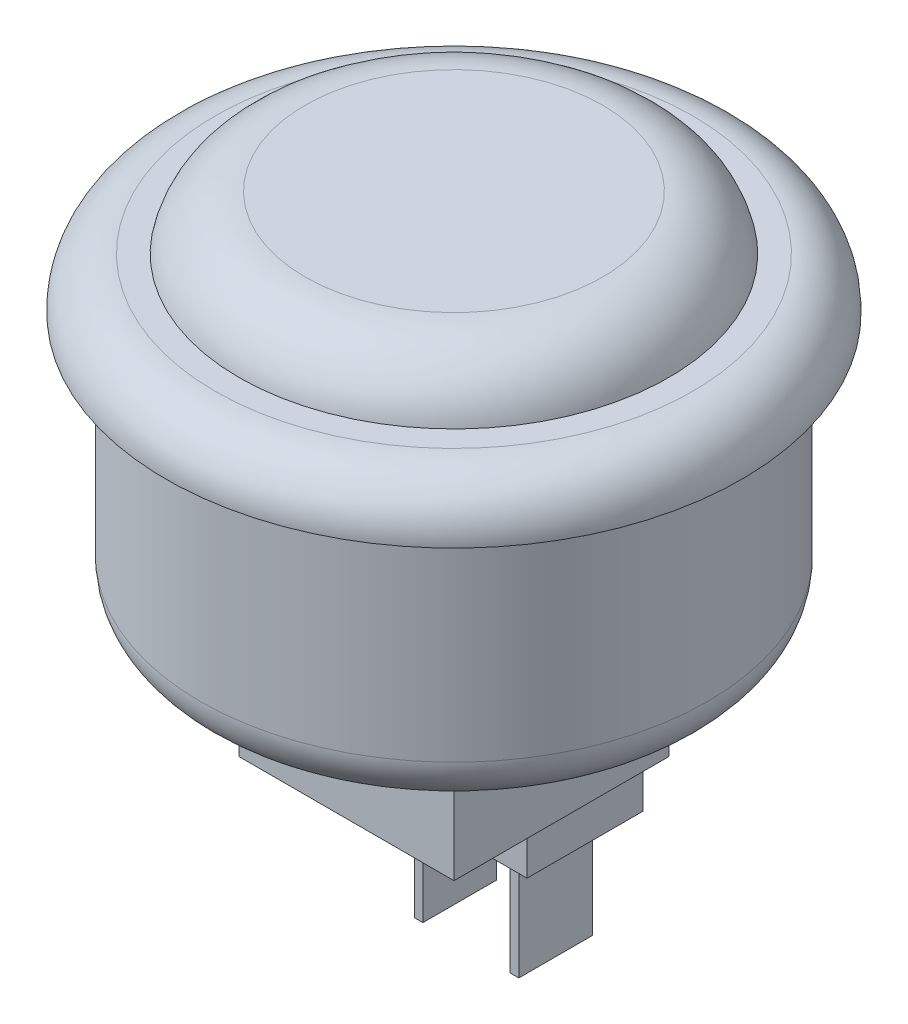
ISO-10303-21;
HEADER;
FILE_DESCRIPTION(('STEP AP214'),'2;1');
FILE_NAME('part.step','',(''),(''),'','','');
FILE_SCHEMA(('AUTOMOTIVE_DESIGN { 1 0 10303 214 1 1 1 1 }'));
ENDSEC;
DATA;
#1=APPLICATION_CONTEXT('core data for automotive mechanical design processes');
#2=APPLICATION_PROTOCOL_DEFINITION('international standard','automotive_design',2000,#1);
#3=PRODUCT_CONTEXT('',#1,'mechanical');
#4=PRODUCT('Part','Part','',(#3));
#5=PRODUCT_RELATED_PRODUCT_CATEGORY('part','',(#4));
#6=PRODUCT_DEFINITION_FORMATION('','',#4);
#7=PRODUCT_DEFINITION_CONTEXT('part definition',#1,'design');
#8=PRODUCT_DEFINITION('design','',#6,#7);
#9=PRODUCT_DEFINITION_SHAPE('','',#8);
#10=(LENGTH_UNIT() NAMED_UNIT(*) SI_UNIT(.MILLI.,.METRE.));
#11=(NAMED_UNIT(*) PLANE_ANGLE_UNIT() SI_UNIT($,.RADIAN.));
#12=(NAMED_UNIT(*) SI_UNIT($,.STERADIAN.) SOLID_ANGLE_UNIT());
#13=UNCERTAINTY_MEASURE_WITH_UNIT(LENGTH_MEASURE(1.E-05),#10,'distance_accuracy_value','');
#14=(GEOMETRIC_REPRESENTATION_CONTEXT(3) GLOBAL_UNCERTAINTY_ASSIGNED_CONTEXT((#13)) GLOBAL_UNIT_ASSIGNED_CONTEXT((#10,
#11,#12)) REPRESENTATION_CONTEXT('',''));
#15=CARTESIAN_POINT('',(0.,0.,0.));
#16=DIRECTION('',(0.,0.,1.));
#17=DIRECTION('',(1.,0.,0.));
#18=AXIS2_PLACEMENT_3D('',#15,#16,#17);
#19=CARTESIAN_POINT('',(0.,-27.8184679207263,0.));
#20=DIRECTION('',(0.,1.,0.));
#21=DIRECTION('',(0.,0.,1.));
#22=AXIS2_PLACEMENT_3D('',#19,#20,#21);
#23=PLANE('',#22);
#24=DIRECTION('',(1.,0.,0.));
#25=VECTOR('',#24,1.);
#26=CARTESIAN_POINT('',(2.54,-27.8184679207263,-0.732880570670309));
#27=LINE('',#26,#25);
#28=CARTESIAN_POINT('',(2.54,-27.8184679207263,-0.732880570670309));
#29=VERTEX_POINT('',#28);
#30=CARTESIAN_POINT('',(3.04,-27.8184679207263,-0.732880570670309));
#31=VERTEX_POINT('',#30);
#32=EDGE_CURVE('E180',#29,#31,#27,.T.);
#33=ORIENTED_EDGE('',*,*,#32,.T.);
#34=DIRECTION('',(0.,0.,-1.));
#35=VECTOR('',#34,1.);
#36=CARTESIAN_POINT('',(3.04,-27.8184679207263,-5.01711942932969));
#37=LINE('',#36,#35);
#38=CARTESIAN_POINT('',(3.04,-27.8184679207263,-5.01711942932969));
#39=VERTEX_POINT('',#38);
#40=EDGE_CURVE('E154',#31,#39,#37,.T.);
#41=ORIENTED_EDGE('',*,*,#40,.T.);
#42=DIRECTION('',(-1.,0.,0.));
#43=VECTOR('',#42,1.);
#44=CARTESIAN_POINT('',(2.54,-27.8184679207263,-5.01711942932969));
#45=LINE('',#44,#43);
#46=CARTESIAN_POINT('',(2.54,-27.8184679207263,-5.01711942932969));
#47=VERTEX_POINT('',#46);
#48=EDGE_CURVE('E170',#39,#47,#45,.T.);
#49=ORIENTED_EDGE('',*,*,#48,.T.);
#50=DIRECTION('',(0.,0.,1.));
#51=VECTOR('',#50,1.);
#52=CARTESIAN_POINT('',(2.54,-27.8184679207263,-5.01711942932969));
#53=LINE('',#52,#51);
#54=EDGE_CURVE('E50',#47,#29,#53,.T.);
#55=ORIENTED_EDGE('',*,*,#54,.T.);
#56=EDGE_LOOP('',(#33,#41,#49,#55));
#57=FACE_BOUND('',#56,.T.);
#58=DIRECTION('',(0.,0.,-1.));
#59=VECTOR('',#58,1.);
#60=CARTESIAN_POINT('',(-5.25,-27.8184679207263,-5.75));
#61=LINE('',#60,#59);
#62=CARTESIAN_POINT('',(-5.25,-27.8184679207263,0.999999999999999));
#63=VERTEX_POINT('',#62);
#64=CARTESIAN_POINT('',(-5.25,-27.8184679207263,-5.75));
#65=VERTEX_POINT('',#64);
#66=EDGE_CURVE('E219',#63,#65,#61,.T.);
#67=ORIENTED_EDGE('',*,*,#66,.T.);
#68=DIRECTION('',(1.,0.,0.));
#69=VECTOR('',#68,1.);
#70=CARTESIAN_POINT('',(-5.25,-27.8184679207263,-5.75));
#71=LINE('',#70,#69);
#72=CARTESIAN_POINT('',(5.25,-27.8184679207263,-5.75));
#73=VERTEX_POINT('',#72);
#74=EDGE_CURVE('E222',#65,#73,#71,.T.);
#75=ORIENTED_EDGE('',*,*,#74,.T.);
#76=DIRECTION('',(0.,0.,1.));
#77=VECTOR('',#76,1.);
#78=CARTESIAN_POINT('',(5.25,-27.8184679207263,-5.75));
#79=LINE('',#78,#77);
#80=CARTESIAN_POINT('',(5.25,-27.8184679207263,1.));
#81=VERTEX_POINT('',#80);
#82=EDGE_CURVE('E225',#73,#81,#79,.T.);
#83=ORIENTED_EDGE('',*,*,#82,.T.);
#84=DIRECTION('',(-1.,0.,0.));
#85=VECTOR('',#84,1.);
#86=CARTESIAN_POINT('',(-5.25,-27.8184679207263,0.999999999999999));
#87=LINE('',#86,#85);
#88=EDGE_CURVE('E227',#81,#63,#87,.T.);
#89=ORIENTED_EDGE('',*,*,#88,.T.);
#90=EDGE_LOOP('',(#67,#75,#83,#89));
#91=FACE_BOUND('',#90,.T.);
#92=DIRECTION('',(0.,0.,-1.));
#93=VECTOR('',#92,1.);
#94=CARTESIAN_POINT('',(-3.04,-27.8184679207263,-5.01711942932969));
#95=LINE('',#94,#93);
#96=CARTESIAN_POINT('',(-3.04,-27.8184679207263,-0.732880570670309));
#97=VERTEX_POINT('',#96);
#98=CARTESIAN_POINT('',(-3.04,-27.8184679207263,-5.01711942932969));
#99=VERTEX_POINT('',#98);
#100=EDGE_CURVE('E159',#97,#99,#95,.T.);
#101=ORIENTED_EDGE('',*,*,#100,.F.);
#102=DIRECTION('',(-1.,0.,0.));
#103=VECTOR('',#102,1.);
#104=CARTESIAN_POINT('',(-2.54,-27.8184679207263,-0.732880570670309));
#105=LINE('',#104,#103);
#106=CARTESIAN_POINT('',(-2.54,-27.8184679207263,-0.732880570670309));
#107=VERTEX_POINT('',#106);
#108=EDGE_CURVE('E193',#107,#97,#105,.T.);
#109=ORIENTED_EDGE('',*,*,#108,.F.);
#110=DIRECTION('',(0.,0.,1.));
#111=VECTOR('',#110,1.);
#112=CARTESIAN_POINT('',(-2.54,-27.8184679207263,-5.01711942932969));
#113=LINE('',#112,#111);
#114=CARTESIAN_POINT('',(-2.54,-27.8184679207263,-5.01711942932969));
#115=VERTEX_POINT('',#114);
#116=EDGE_CURVE('E203',#115,#107,#113,.T.);
#117=ORIENTED_EDGE('',*,*,#116,.F.);
#118=DIRECTION('',(1.,0.,0.));
#119=VECTOR('',#118,1.);
#120=CARTESIAN_POINT('',(-2.54,-27.8184679207263,-5.01711942932969));
#121=LINE('',#120,#119);
#122=EDGE_CURVE('E58',#99,#115,#121,.T.);
#123=ORIENTED_EDGE('',*,*,#122,.F.);
#124=EDGE_LOOP('',(#101,#109,#117,#123));
#125=FACE_BOUND('',#124,.T.);
#126=ADVANCED_FACE('F35',(#57,#91,#125),#23,.F.);
#127=CARTESIAN_POINT('',(0.,-24.8184679207263,0.));
#128=DIRECTION('',(0.,-1.,0.));
#129=DIRECTION('',(0.,0.,-1.));
#130=AXIS2_PLACEMENT_3D('',#127,#128,#129);
#131=PLANE('',#130);
#132=DIRECTION('',(0.,0.,-1.));
#133=VECTOR('',#132,1.);
#134=CARTESIAN_POINT('',(-6.25,-24.8184679207263,-6.25));
#135=LINE('',#134,#133);
#136=CARTESIAN_POINT('',(-6.25,-24.8184679207263,6.25));
#137=VERTEX_POINT('',#136);
#138=CARTESIAN_POINT('',(-6.25,-24.8184679207263,-6.25));
#139=VERTEX_POINT('',#138);
#140=EDGE_CURVE('E248',#137,#139,#135,.T.);
#141=ORIENTED_EDGE('',*,*,#140,.T.);
#142=DIRECTION('',(1.,0.,0.));
#143=VECTOR('',#142,1.);
#144=CARTESIAN_POINT('',(6.25,-24.8184679207263,-6.25));
#145=LINE('',#144,#143);
#146=CARTESIAN_POINT('',(6.25,-24.8184679207263,-6.25));
#147=VERTEX_POINT('',#146);
#148=EDGE_CURVE('E251',#139,#147,#145,.T.);
#149=ORIENTED_EDGE('',*,*,#148,.T.);
#150=DIRECTION('',(0.,0.,1.));
#151=VECTOR('',#150,1.);
#152=CARTESIAN_POINT('',(6.25,-24.8184679207263,-6.25));
#153=LINE('',#152,#151);
#154=CARTESIAN_POINT('',(6.25,-24.8184679207263,6.25));
#155=VERTEX_POINT('',#154);
#156=EDGE_CURVE('E254',#147,#155,#153,.T.);
#157=ORIENTED_EDGE('',*,*,#156,.T.);
#158=DIRECTION('',(-1.,0.,0.));
#159=VECTOR('',#158,1.);
#160=CARTESIAN_POINT('',(6.25,-24.8184679207263,6.25));
#161=LINE('',#160,#159);
#162=EDGE_CURVE('E256',#155,#137,#161,.T.);
#163=ORIENTED_EDGE('',*,*,#162,.T.);
#164=EDGE_LOOP('',(#141,#149,#157,#163));
#165=FACE_BOUND('',#164,.T.);
#166=DIRECTION('',(1.,0.,0.));
#167=VECTOR('',#166,1.);
#168=CARTESIAN_POINT('',(-5.25,-24.8184679207263,-5.75));
#169=LINE('',#168,#167);
#170=CARTESIAN_POINT('',(-5.25,-24.8184679207263,-5.75));
#171=VERTEX_POINT('',#170);
#172=CARTESIAN_POINT('',(5.25,-24.8184679207263,-5.75));
#173=VERTEX_POINT('',#172);
#174=EDGE_CURVE('E232',#171,#173,#169,.T.);
#175=ORIENTED_EDGE('',*,*,#174,.F.);
#176=DIRECTION('',(0.,0.,-1.));
#177=VECTOR('',#176,1.);
#178=CARTESIAN_POINT('',(-5.25,-24.8184679207263,-5.75));
#179=LINE('',#178,#177);
#180=CARTESIAN_POINT('',(-5.25,-24.8184679207263,0.999999999999999));
#181=VERTEX_POINT('',#180);
#182=EDGE_CURVE('E218',#181,#171,#179,.T.);
#183=ORIENTED_EDGE('',*,*,#182,.F.);
#184=DIRECTION('',(-1.,0.,0.));
#185=VECTOR('',#184,1.);
#186=CARTESIAN_POINT('',(-5.25,-24.8184679207263,0.999999999999999));
#187=LINE('',#186,#185);
#188=CARTESIAN_POINT('',(5.25,-24.8184679207263,1.));
#189=VERTEX_POINT('',#188);
#190=EDGE_CURVE('E223',#189,#181,#187,.T.);
#191=ORIENTED_EDGE('',*,*,#190,.F.);
#192=DIRECTION('',(0.,0.,1.));
#193=VECTOR('',#192,1.);
#194=CARTESIAN_POINT('',(5.25,-24.8184679207263,-5.75));
#195=LINE('',#194,#193);
#196=EDGE_CURVE('E234',#173,#189,#195,.T.);
#197=ORIENTED_EDGE('',*,*,#196,.F.);
#198=EDGE_LOOP('',(#175,#183,#191,#197));
#199=FACE_BOUND('',#198,.T.);
#200=ADVANCED_FACE('F309',(#165,#199),#131,.T.);
#201=CARTESIAN_POINT('',(-11.951700753752,-17.4684679207263,0.));
#202=DIRECTION('',(0.,1.,0.));
#203=DIRECTION('',(0.,0.,1.));
#204=AXIS2_PLACEMENT_3D('',#201,#202,#203);
#205=PLANE('',#204);
#206=CARTESIAN_POINT('',(0.,-17.4684679207263,0.));
#207=DIRECTION('',(0.,-1.,0.));
#208=DIRECTION('',(0.,0.,-1.));
#209=AXIS2_PLACEMENT_3D('',#206,#207,#208);
#210=CIRCLE('',#209,11.951700753752);
#211=CARTESIAN_POINT('',(0.,-17.4684679207263,-11.951700753752));
#212=VERTEX_POINT('',#211);
#213=EDGE_CURVE('E280',#212,#212,#210,.T.);
#214=ORIENTED_EDGE('',*,*,#213,.T.);
#215=EDGE_LOOP('',(#214));
#216=FACE_BOUND('',#215,.T.);
#217=DIRECTION('',(0.,0.,-1.));
#218=VECTOR('',#217,1.);
#219=CARTESIAN_POINT('',(-6.25,-17.4684679207263,-6.25));
#220=LINE('',#219,#218);
#221=CARTESIAN_POINT('',(-6.25,-17.4684679207263,6.25));
#222=VERTEX_POINT('',#221);
#223=CARTESIAN_POINT('',(-6.25,-17.4684679207263,-6.25));
#224=VERTEX_POINT('',#223);
#225=EDGE_CURVE('E247',#222,#224,#220,.T.);
#226=ORIENTED_EDGE('',*,*,#225,.F.);
#227=DIRECTION('',(-1.,0.,0.));
#228=VECTOR('',#227,1.);
#229=CARTESIAN_POINT('',(6.25,-17.4684679207263,6.25));
#230=LINE('',#229,#228);
#231=CARTESIAN_POINT('',(6.25,-17.4684679207263,6.25));
#232=VERTEX_POINT('',#231);
#233=EDGE_CURVE('E252',#232,#222,#230,.T.);
#234=ORIENTED_EDGE('',*,*,#233,.F.);
#235=DIRECTION('',(0.,0.,1.));
#236=VECTOR('',#235,1.);
#237=CARTESIAN_POINT('',(6.25,-17.4684679207263,-6.25));
#238=LINE('',#237,#236);
#239=CARTESIAN_POINT('',(6.25,-17.4684679207263,-6.25));
#240=VERTEX_POINT('',#239);
#241=EDGE_CURVE('E264',#240,#232,#238,.T.);
#242=ORIENTED_EDGE('',*,*,#241,.F.);
#243=DIRECTION('',(1.,0.,0.));
#244=VECTOR('',#243,1.);
#245=CARTESIAN_POINT('',(6.25,-17.4684679207263,-6.25));
#246=LINE('',#245,#244);
#247=EDGE_CURVE('E261',#224,#240,#246,.T.);
#248=ORIENTED_EDGE('',*,*,#247,.F.);
#249=EDGE_LOOP('',(#226,#234,#242,#248));
#250=FACE_BOUND('',#249,.T.);
#251=ADVANCED_FACE('F305',(#216,#250),#205,.F.);
#252=CARTESIAN_POINT('',(0.,3.67943207927373,0.));
#253=DIRECTION('',(0.,-1.,0.));
#254=DIRECTION('',(0.,0.,-1.));
#255=AXIS2_PLACEMENT_3D('',#252,#253,#254);
#256=PLANE('',#255);
#257=CARTESIAN_POINT('',(0.,3.67943207927373,0.));
#258=DIRECTION('',(0.,-1.,0.));
#259=DIRECTION('',(0.,0.,-1.));
#260=AXIS2_PLACEMENT_3D('',#257,#258,#259);
#261=CIRCLE('',#260,8.65936131633854);
#262=CARTESIAN_POINT('',(0.,3.67943207927373,-8.65936131633854));
#263=VERTEX_POINT('',#262);
#264=EDGE_CURVE('E11',#263,#263,#261,.T.);
#265=ORIENTED_EDGE('',*,*,#264,.F.);
#266=EDGE_LOOP('',(#265));
#267=FACE_BOUND('',#266,.T.);
#268=ADVANCED_FACE('F37',(#267),#256,.F.);
#269=CARTESIAN_POINT('',(0.,-0.237429941190199,0.));
#270=DIRECTION('',(0.,-1.,0.));
#271=DIRECTION('',(0.,0.,-1.));
#272=AXIS2_PLACEMENT_3D('',#269,#270,#271);
#273=TOROIDAL_SURFACE('',#272,8.65936131633854,3.91686202046393);
#274=CARTESIAN_POINT('',(0.,0.531532079273732,0.));
#275=DIRECTION('',(0.,-1.,0.));
#276=DIRECTION('',(0.,0.,-1.));
#277=AXIS2_PLACEMENT_3D('',#274,#275,#276);
#278=CIRCLE('',#277,12.5);
#279=CARTESIAN_POINT('',(0.,0.531532079273732,-12.5));
#280=VERTEX_POINT('',#279);
#281=EDGE_CURVE('E43',#280,#280,#278,.T.);
#282=ORIENTED_EDGE('',*,*,#281,.F.);
#283=EDGE_LOOP('',(#282));
#284=FACE_BOUND('',#283,.T.);
#285=ORIENTED_EDGE('',*,*,#264,.T.);
#286=EDGE_LOOP('',(#285));
#287=FACE_BOUND('',#286,.T.);
#288=ADVANCED_FACE('F299',(#284,#287),#273,.T.);
#289=CARTESIAN_POINT('',(-12.5,0.531532079273732,0.));
#290=DIRECTION('',(0.,-1.,0.));
#291=DIRECTION('',(0.,0.,-1.));
#292=AXIS2_PLACEMENT_3D('',#289,#290,#291);
#293=PLANE('',#292);
#294=CARTESIAN_POINT('',(0.,0.531532079273732,0.));
#295=DIRECTION('',(0.,-1.,0.));
#296=DIRECTION('',(0.,0.,-1.));
#297=AXIS2_PLACEMENT_3D('',#294,#295,#296);
#298=CIRCLE('',#297,13.8881191217168);
#299=CARTESIAN_POINT('',(0.,0.531532079273732,-13.8881191217168));
#300=VERTEX_POINT('',#299);
#301=EDGE_CURVE('E292',#300,#300,#298,.T.);
#302=ORIENTED_EDGE('',*,*,#301,.F.);
#303=EDGE_LOOP('',(#302));
#304=FACE_BOUND('',#303,.T.);
#305=ORIENTED_EDGE('',*,*,#281,.T.);
#306=EDGE_LOOP('',(#305));
#307=FACE_BOUND('',#306,.T.);
#308=ADVANCED_FACE('F297',(#304,#307),#293,.F.);
#309=CARTESIAN_POINT('',(0.,-2.33352828097341,0.));
#310=DIRECTION('',(0.,-1.,0.));
#311=DIRECTION('',(0.,0.,-1.));
#312=AXIS2_PLACEMENT_3D('',#309,#310,#311);
#313=TOROIDAL_SURFACE('',#312,13.8881191217168,2.86506036024714);
#314=CARTESIAN_POINT('',(0.,-2.46846792072627,0.));
#315=DIRECTION('',(0.,-1.,0.));
#316=DIRECTION('',(0.,0.,-1.));
#317=AXIS2_PLACEMENT_3D('',#314,#315,#316);
#318=CIRCLE('',#317,16.75);
#319=CARTESIAN_POINT('',(0.,-2.46846792072627,-16.75));
#320=VERTEX_POINT('',#319);
#321=EDGE_CURVE('E289',#320,#320,#318,.T.);
#322=ORIENTED_EDGE('',*,*,#321,.F.);
#323=EDGE_LOOP('',(#322));
#324=FACE_BOUND('',#323,.T.);
#325=ORIENTED_EDGE('',*,*,#301,.T.);
#326=EDGE_LOOP('',(#325));
#327=FACE_BOUND('',#326,.T.);
#328=ADVANCED_FACE('F368',(#324,#327),#313,.T.);
#329=CARTESIAN_POINT('',(-16.75,-2.46846792072627,0.));
#330=DIRECTION('',(0.,1.,0.));
#331=DIRECTION('',(0.,0.,1.));
#332=AXIS2_PLACEMENT_3D('',#329,#330,#331);
#333=PLANE('',#332);
#334=CARTESIAN_POINT('',(0.,-2.46846792072627,0.));
#335=DIRECTION('',(0.,-1.,0.));
#336=DIRECTION('',(0.,0.,-1.));
#337=AXIS2_PLACEMENT_3D('',#334,#335,#336);
#338=CIRCLE('',#337,14.75);
#339=CARTESIAN_POINT('',(0.,-2.46846792072627,-14.75));
#340=VERTEX_POINT('',#339);
#341=EDGE_CURVE('E286',#340,#340,#338,.T.);
#342=ORIENTED_EDGE('',*,*,#341,.F.);
#343=EDGE_LOOP('',(#342));
#344=FACE_BOUND('',#343,.T.);
#345=ORIENTED_EDGE('',*,*,#321,.T.);
#346=EDGE_LOOP('',(#345));
#347=FACE_BOUND('',#346,.T.);
#348=ADVANCED_FACE('F364',(#344,#347),#333,.F.);
#349=CARTESIAN_POINT('',(0.,0.,0.));
#350=DIRECTION('',(0.,-1.,0.));
#351=DIRECTION('',(0.,0.,-1.));
#352=AXIS2_PLACEMENT_3D('',#349,#350,#351);
#353=CYLINDRICAL_SURFACE('',#352,14.75);
#354=CARTESIAN_POINT('',(0.,-14.6701686744782,0.));
#355=DIRECTION('',(0.,-1.,0.));
#356=DIRECTION('',(0.,0.,-1.));
#357=AXIS2_PLACEMENT_3D('',#354,#355,#356);
#358=CIRCLE('',#357,14.75);
#359=CARTESIAN_POINT('',(0.,-14.6701686744782,-14.75));
#360=VERTEX_POINT('',#359);
#361=EDGE_CURVE('E283',#360,#360,#358,.T.);
#362=ORIENTED_EDGE('',*,*,#361,.F.);
#363=EDGE_LOOP('',(#362));
#364=FACE_BOUND('',#363,.T.);
#365=ORIENTED_EDGE('',*,*,#341,.T.);
#366=EDGE_LOOP('',(#365));
#367=FACE_BOUND('',#366,.T.);
#368=ADVANCED_FACE('F360',(#364,#367),#353,.T.);
#369=CARTESIAN_POINT('',(0.,-14.6701686744782,0.));
#370=DIRECTION('',(0.,-1.,0.));
#371=DIRECTION('',(0.,0.,-1.));
#372=AXIS2_PLACEMENT_3D('',#369,#370,#371);
#373=TOROIDAL_SURFACE('',#372,11.951700753752,2.79829924624802);
#374=ORIENTED_EDGE('',*,*,#213,.F.);
#375=EDGE_LOOP('',(#374));
#376=FACE_BOUND('',#375,.T.);
#377=ORIENTED_EDGE('',*,*,#361,.T.);
#378=EDGE_LOOP('',(#377));
#379=FACE_BOUND('',#378,.T.);
#380=ADVANCED_FACE('F355',(#376,#379),#373,.T.);
#381=CARTESIAN_POINT('',(-6.25,-24.8184679207263,-6.25));
#382=DIRECTION('',(1.,0.,0.));
#383=DIRECTION('',(0.,0.,-1.));
#384=AXIS2_PLACEMENT_3D('',#381,#382,#383);
#385=PLANE('',#384);
#386=ORIENTED_EDGE('',*,*,#225,.T.);
#387=DIRECTION('',(0.,1.,0.));
#388=VECTOR('',#387,1.);
#389=CARTESIAN_POINT('',(-6.25,-24.8184679207263,-6.25));
#390=LINE('',#389,#388);
#391=EDGE_CURVE('E277',#139,#224,#390,.T.);
#392=ORIENTED_EDGE('',*,*,#391,.F.);
#393=ORIENTED_EDGE('',*,*,#140,.F.);
#394=DIRECTION('',(0.,1.,0.));
#395=VECTOR('',#394,1.);
#396=CARTESIAN_POINT('',(-6.25,-24.8184679207263,6.25));
#397=LINE('',#396,#395);
#398=EDGE_CURVE('E258',#137,#222,#397,.T.);
#399=ORIENTED_EDGE('',*,*,#398,.T.);
#400=EDGE_LOOP('',(#386,#392,#393,#399));
#401=FACE_BOUND('',#400,.T.);
#402=ADVANCED_FACE('F352',(#401),#385,.F.);
#403=CARTESIAN_POINT('',(6.25,-24.8184679207263,-6.25));
#404=DIRECTION('',(0.,0.,1.));
#405=DIRECTION('',(1.,0.,0.));
#406=AXIS2_PLACEMENT_3D('',#403,#404,#405);
#407=PLANE('',#406);
#408=ORIENTED_EDGE('',*,*,#247,.T.);
#409=DIRECTION('',(0.,1.,0.));
#410=VECTOR('',#409,1.);
#411=CARTESIAN_POINT('',(6.25,-24.8184679207263,-6.25));
#412=LINE('',#411,#410);
#413=EDGE_CURVE('E274',#147,#240,#412,.T.);
#414=ORIENTED_EDGE('',*,*,#413,.F.);
#415=ORIENTED_EDGE('',*,*,#148,.F.);
#416=ORIENTED_EDGE('',*,*,#391,.T.);
#417=EDGE_LOOP('',(#408,#414,#415,#416));
#418=FACE_BOUND('',#417,.T.);
#419=ADVANCED_FACE('F348',(#418),#407,.F.);
#420=CARTESIAN_POINT('',(6.25,-24.8184679207263,-6.25));
#421=DIRECTION('',(-1.,0.,0.));
#422=DIRECTION('',(0.,0.,1.));
#423=AXIS2_PLACEMENT_3D('',#420,#421,#422);
#424=PLANE('',#423);
#425=ORIENTED_EDGE('',*,*,#241,.T.);
#426=DIRECTION('',(0.,1.,0.));
#427=VECTOR('',#426,1.);
#428=CARTESIAN_POINT('',(6.25,-24.8184679207263,6.25));
#429=LINE('',#428,#427);
#430=EDGE_CURVE('E271',#155,#232,#429,.T.);
#431=ORIENTED_EDGE('',*,*,#430,.F.);
#432=ORIENTED_EDGE('',*,*,#156,.F.);
#433=ORIENTED_EDGE('',*,*,#413,.T.);
#434=EDGE_LOOP('',(#425,#431,#432,#433));
#435=FACE_BOUND('',#434,.T.);
#436=ADVANCED_FACE('F344',(#435),#424,.F.);
#437=CARTESIAN_POINT('',(6.25,-24.8184679207263,6.25));
#438=DIRECTION('',(0.,0.,-1.));
#439=DIRECTION('',(-1.,0.,0.));
#440=AXIS2_PLACEMENT_3D('',#437,#438,#439);
#441=PLANE('',#440);
#442=ORIENTED_EDGE('',*,*,#233,.T.);
#443=ORIENTED_EDGE('',*,*,#398,.F.);
#444=ORIENTED_EDGE('',*,*,#162,.F.);
#445=ORIENTED_EDGE('',*,*,#430,.T.);
#446=EDGE_LOOP('',(#442,#443,#444,#445));
#447=FACE_BOUND('',#446,.T.);
#448=ADVANCED_FACE('F339',(#447),#441,.F.);
#449=CARTESIAN_POINT('',(-5.25,-27.8184679207263,-5.75));
#450=DIRECTION('',(1.,0.,0.));
#451=DIRECTION('',(0.,0.,-1.));
#452=AXIS2_PLACEMENT_3D('',#449,#450,#451);
#453=PLANE('',#452);
#454=ORIENTED_EDGE('',*,*,#182,.T.);
#455=DIRECTION('',(0.,1.,0.));
#456=VECTOR('',#455,1.);
#457=CARTESIAN_POINT('',(-5.25,-27.8184679207263,-5.75));
#458=LINE('',#457,#456);
#459=EDGE_CURVE('E245',#65,#171,#458,.T.);
#460=ORIENTED_EDGE('',*,*,#459,.F.);
#461=ORIENTED_EDGE('',*,*,#66,.F.);
#462=DIRECTION('',(0.,1.,0.));
#463=VECTOR('',#462,1.);
#464=CARTESIAN_POINT('',(-5.25,-27.8184679207263,0.999999999999999));
#465=LINE('',#464,#463);
#466=EDGE_CURVE('E229',#63,#181,#465,.T.);
#467=ORIENTED_EDGE('',*,*,#466,.T.);
#468=EDGE_LOOP('',(#454,#460,#461,#467));
#469=FACE_BOUND('',#468,.T.);
#470=ADVANCED_FACE('F336',(#469),#453,.F.);
#471=CARTESIAN_POINT('',(-5.25,-27.8184679207263,-5.75));
#472=DIRECTION('',(0.,0.,1.));
#473=DIRECTION('',(1.,0.,0.));
#474=AXIS2_PLACEMENT_3D('',#471,#472,#473);
#475=PLANE('',#474);
#476=ORIENTED_EDGE('',*,*,#174,.T.);
#477=DIRECTION('',(0.,1.,0.));
#478=VECTOR('',#477,1.);
#479=CARTESIAN_POINT('',(5.25,-27.8184679207263,-5.75));
#480=LINE('',#479,#478);
#481=EDGE_CURVE('E242',#73,#173,#480,.T.);
#482=ORIENTED_EDGE('',*,*,#481,.F.);
#483=ORIENTED_EDGE('',*,*,#74,.F.);
#484=ORIENTED_EDGE('',*,*,#459,.T.);
#485=EDGE_LOOP('',(#476,#482,#483,#484));
#486=FACE_BOUND('',#485,.T.);
#487=ADVANCED_FACE('F332',(#486),#475,.F.);
#488=CARTESIAN_POINT('',(5.25,-27.8184679207263,-5.75));
#489=DIRECTION('',(-1.,0.,0.));
#490=DIRECTION('',(0.,0.,1.));
#491=AXIS2_PLACEMENT_3D('',#488,#489,#490);
#492=PLANE('',#491);
#493=ORIENTED_EDGE('',*,*,#196,.T.);
#494=DIRECTION('',(0.,1.,0.));
#495=VECTOR('',#494,1.);
#496=CARTESIAN_POINT('',(5.25,-27.8184679207263,1.));
#497=LINE('',#496,#495);
#498=EDGE_CURVE('E240',#81,#189,#497,.T.);
#499=ORIENTED_EDGE('',*,*,#498,.F.);
#500=ORIENTED_EDGE('',*,*,#82,.F.);
#501=ORIENTED_EDGE('',*,*,#481,.T.);
#502=EDGE_LOOP('',(#493,#499,#500,#501));
#503=FACE_BOUND('',#502,.T.);
#504=ADVANCED_FACE('F328',(#503),#492,.F.);
#505=CARTESIAN_POINT('',(-5.25,-27.8184679207263,0.999999999999999));
#506=DIRECTION('',(0.,0.,-1.));
#507=DIRECTION('',(-1.,0.,0.));
#508=AXIS2_PLACEMENT_3D('',#505,#506,#507);
#509=PLANE('',#508);
#510=ORIENTED_EDGE('',*,*,#190,.T.);
#511=ORIENTED_EDGE('',*,*,#466,.F.);
#512=ORIENTED_EDGE('',*,*,#88,.F.);
#513=ORIENTED_EDGE('',*,*,#498,.T.);
#514=EDGE_LOOP('',(#510,#511,#512,#513));
#515=FACE_BOUND('',#514,.T.);
#516=ADVANCED_FACE('F325',(#515),#509,.F.);
#517=CARTESIAN_POINT('',(-3.04,-34.8184679207263,-5.01711942932969));
#518=DIRECTION('',(1.,0.,0.));
#519=DIRECTION('',(0.,0.,-1.));
#520=AXIS2_PLACEMENT_3D('',#517,#518,#519);
#521=PLANE('',#520);
#522=ORIENTED_EDGE('',*,*,#100,.T.);
#523=DIRECTION('',(0.,1.,0.));
#524=VECTOR('',#523,1.);
#525=CARTESIAN_POINT('',(-3.04,-34.8184679207263,-5.01711942932969));
#526=LINE('',#525,#524);
#527=CARTESIAN_POINT('',(-3.04,-34.8184679207263,-5.01711942932969));
#528=VERTEX_POINT('',#527);
#529=EDGE_CURVE('E216',#528,#99,#526,.T.);
#530=ORIENTED_EDGE('',*,*,#529,.F.);
#531=DIRECTION('',(0.,0.,-1.));
#532=VECTOR('',#531,1.);
#533=CARTESIAN_POINT('',(-3.04,-34.8184679207263,-5.01711942932969));
#534=LINE('',#533,#532);
#535=CARTESIAN_POINT('',(-3.04,-34.8184679207263,-0.732880570670309));
#536=VERTEX_POINT('',#535);
#537=EDGE_CURVE('E189',#536,#528,#534,.T.);
#538=ORIENTED_EDGE('',*,*,#537,.F.);
#539=DIRECTION('',(0.,1.,0.));
#540=VECTOR('',#539,1.);
#541=CARTESIAN_POINT('',(-3.04,-34.8184679207263,-0.732880570670309));
#542=LINE('',#541,#540);
#543=EDGE_CURVE('E199',#536,#97,#542,.T.);
#544=ORIENTED_EDGE('',*,*,#543,.T.);
#545=EDGE_LOOP('',(#522,#530,#538,#544));
#546=FACE_BOUND('',#545,.T.);
#547=ADVANCED_FACE('F323',(#546),#521,.F.);
#548=CARTESIAN_POINT('',(-2.54,-34.8184679207263,-5.01711942932969));
#549=DIRECTION('',(0.,0.,1.));
#550=DIRECTION('',(1.,0.,0.));
#551=AXIS2_PLACEMENT_3D('',#548,#549,#550);
#552=PLANE('',#551);
#553=ORIENTED_EDGE('',*,*,#122,.T.);
#554=DIRECTION('',(0.,1.,0.));
#555=VECTOR('',#554,1.);
#556=CARTESIAN_POINT('',(-2.54,-34.8184679207263,-5.01711942932969));
#557=LINE('',#556,#555);
#558=CARTESIAN_POINT('',(-2.54,-34.8184679207263,-5.01711942932969));
#559=VERTEX_POINT('',#558);
#560=EDGE_CURVE('E213',#559,#115,#557,.T.);
#561=ORIENTED_EDGE('',*,*,#560,.F.);
#562=DIRECTION('',(1.,0.,0.));
#563=VECTOR('',#562,1.);
#564=CARTESIAN_POINT('',(-2.54,-34.8184679207263,-5.01711942932969));
#565=LINE('',#564,#563);
#566=EDGE_CURVE('E192',#528,#559,#565,.T.);
#567=ORIENTED_EDGE('',*,*,#566,.F.);
#568=ORIENTED_EDGE('',*,*,#529,.T.);
#569=EDGE_LOOP('',(#553,#561,#567,#568));
#570=FACE_BOUND('',#569,.T.);
#571=ADVANCED_FACE('F437',(#570),#552,.F.);
#572=CARTESIAN_POINT('',(-2.54,-34.8184679207263,-5.01711942932969));
#573=DIRECTION('',(-1.,0.,0.));
#574=DIRECTION('',(0.,0.,1.));
#575=AXIS2_PLACEMENT_3D('',#572,#573,#574);
#576=PLANE('',#575);
#577=ORIENTED_EDGE('',*,*,#116,.T.);
#578=DIRECTION('',(0.,1.,0.));
#579=VECTOR('',#578,1.);
#580=CARTESIAN_POINT('',(-2.54,-34.8184679207263,-0.732880570670309));
#581=LINE('',#580,#579);
#582=CARTESIAN_POINT('',(-2.54,-34.8184679207263,-0.732880570670309));
#583=VERTEX_POINT('',#582);
#584=EDGE_CURVE('E210',#583,#107,#581,.T.);
#585=ORIENTED_EDGE('',*,*,#584,.F.);
#586=DIRECTION('',(0.,0.,1.));
#587=VECTOR('',#586,1.);
#588=CARTESIAN_POINT('',(-2.54,-34.8184679207263,-5.01711942932969));
#589=LINE('',#588,#587);
#590=EDGE_CURVE('E195',#559,#583,#589,.T.);
#591=ORIENTED_EDGE('',*,*,#590,.F.);
#592=ORIENTED_EDGE('',*,*,#560,.T.);
#593=EDGE_LOOP('',(#577,#585,#591,#592));
#594=FACE_BOUND('',#593,.T.);
#595=ADVANCED_FACE('F444',(#594),#576,.F.);
#596=CARTESIAN_POINT('',(-2.54,-34.8184679207263,-0.732880570670309));
#597=DIRECTION('',(0.,0.,-1.));
#598=DIRECTION('',(-1.,0.,0.));
#599=AXIS2_PLACEMENT_3D('',#596,#597,#598);
#600=PLANE('',#599);
#601=ORIENTED_EDGE('',*,*,#108,.T.);
#602=ORIENTED_EDGE('',*,*,#543,.F.);
#603=DIRECTION('',(-1.,0.,0.));
#604=VECTOR('',#603,1.);
#605=CARTESIAN_POINT('',(-2.54,-34.8184679207263,-0.732880570670309));
#606=LINE('',#605,#604);
#607=EDGE_CURVE('E197',#583,#536,#606,.T.);
#608=ORIENTED_EDGE('',*,*,#607,.F.);
#609=ORIENTED_EDGE('',*,*,#584,.T.);
#610=EDGE_LOOP('',(#601,#602,#608,#609));
#611=FACE_BOUND('',#610,.T.);
#612=ADVANCED_FACE('F451',(#611),#600,.F.);
#613=CARTESIAN_POINT('',(0.,-34.8184679207263,0.));
#614=DIRECTION('',(0.,-1.,0.));
#615=DIRECTION('',(0.,0.,-1.));
#616=AXIS2_PLACEMENT_3D('',#613,#614,#615);
#617=PLANE('',#616);
#618=ORIENTED_EDGE('',*,*,#537,.T.);
#619=ORIENTED_EDGE('',*,*,#566,.T.);
#620=ORIENTED_EDGE('',*,*,#590,.T.);
#621=ORIENTED_EDGE('',*,*,#607,.T.);
#622=EDGE_LOOP('',(#618,#619,#620,#621));
#623=FACE_BOUND('',#622,.T.);
#624=ADVANCED_FACE('F459',(#623),#617,.T.);
#625=CARTESIAN_POINT('',(3.04,-34.8184679207263,-5.01711942932969));
#626=DIRECTION('',(1.,0.,0.));
#627=DIRECTION('',(0.,0.,-1.));
#628=AXIS2_PLACEMENT_3D('',#625,#626,#627);
#629=PLANE('',#628);
#630=ORIENTED_EDGE('',*,*,#40,.F.);
#631=DIRECTION('',(0.,1.,0.));
#632=VECTOR('',#631,1.);
#633=CARTESIAN_POINT('',(3.04,-34.8184679207263,-0.732880570670309));
#634=LINE('',#633,#632);
#635=CARTESIAN_POINT('',(3.04,-34.8184679207263,-0.732880570670309));
#636=VERTEX_POINT('',#635);
#637=EDGE_CURVE('E148',#636,#31,#634,.T.);
#638=ORIENTED_EDGE('',*,*,#637,.F.);
#639=DIRECTION('',(0.,0.,-1.));
#640=VECTOR('',#639,1.);
#641=CARTESIAN_POINT('',(3.04,-34.8184679207263,-5.01711942932969));
#642=LINE('',#641,#640);
#643=CARTESIAN_POINT('',(3.04,-34.8184679207263,-5.01711942932969));
#644=VERTEX_POINT('',#643);
#645=EDGE_CURVE('E151',#636,#644,#642,.T.);
#646=ORIENTED_EDGE('',*,*,#645,.T.);
#647=DIRECTION('',(0.,1.,0.));
#648=VECTOR('',#647,1.);
#649=CARTESIAN_POINT('',(3.04,-34.8184679207263,-5.01711942932969));
#650=LINE('',#649,#648);
#651=EDGE_CURVE('E178',#644,#39,#650,.T.);
#652=ORIENTED_EDGE('',*,*,#651,.T.);
#653=EDGE_LOOP('',(#630,#638,#646,#652));
#654=FACE_BOUND('',#653,.T.);
#655=ADVANCED_FACE('F150',(#654),#629,.T.);
#656=CARTESIAN_POINT('',(2.54,-34.8184679207263,-0.732880570670309));
#657=DIRECTION('',(0.,0.,1.));
#658=DIRECTION('',(1.,0.,0.));
#659=AXIS2_PLACEMENT_3D('',#656,#657,#658);
#660=PLANE('',#659);
#661=ORIENTED_EDGE('',*,*,#32,.F.);
#662=DIRECTION('',(0.,1.,0.));
#663=VECTOR('',#662,1.);
#664=CARTESIAN_POINT('',(2.54,-34.8184679207263,-0.732880570670309));
#665=LINE('',#664,#663);
#666=CARTESIAN_POINT('',(2.54,-34.8184679207263,-0.732880570670309));
#667=VERTEX_POINT('',#666);
#668=EDGE_CURVE('E160',#667,#29,#665,.T.);
#669=ORIENTED_EDGE('',*,*,#668,.F.);
#670=DIRECTION('',(1.,0.,0.));
#671=VECTOR('',#670,1.);
#672=CARTESIAN_POINT('',(2.54,-34.8184679207263,-0.732880570670309));
#673=LINE('',#672,#671);
#674=EDGE_CURVE('E166',#667,#636,#673,.T.);
#675=ORIENTED_EDGE('',*,*,#674,.T.);
#676=ORIENTED_EDGE('',*,*,#637,.T.);
#677=EDGE_LOOP('',(#661,#669,#675,#676));
#678=FACE_BOUND('',#677,.T.);
#679=ADVANCED_FACE('F172',(#678),#660,.T.);
#680=CARTESIAN_POINT('',(2.54,-34.8184679207263,-5.01711942932969));
#681=DIRECTION('',(-1.,0.,0.));
#682=DIRECTION('',(0.,0.,1.));
#683=AXIS2_PLACEMENT_3D('',#680,#681,#682);
#684=PLANE('',#683);
#685=ORIENTED_EDGE('',*,*,#54,.F.);
#686=DIRECTION('',(0.,1.,0.));
#687=VECTOR('',#686,1.);
#688=CARTESIAN_POINT('',(2.54,-34.8184679207263,-5.01711942932969));
#689=LINE('',#688,#687);
#690=CARTESIAN_POINT('',(2.54,-34.8184679207263,-5.01711942932969));
#691=VERTEX_POINT('',#690);
#692=EDGE_CURVE('E186',#691,#47,#689,.T.);
#693=ORIENTED_EDGE('',*,*,#692,.F.);
#694=DIRECTION('',(0.,0.,1.));
#695=VECTOR('',#694,1.);
#696=CARTESIAN_POINT('',(2.54,-34.8184679207263,-5.01711942932969));
#697=LINE('',#696,#695);
#698=EDGE_CURVE('E173',#691,#667,#697,.T.);
#699=ORIENTED_EDGE('',*,*,#698,.T.);
#700=ORIENTED_EDGE('',*,*,#668,.T.);
#701=EDGE_LOOP('',(#685,#693,#699,#700));
#702=FACE_BOUND('',#701,.T.);
#703=ADVANCED_FACE('F481',(#702),#684,.T.);
#704=CARTESIAN_POINT('',(2.54,-34.8184679207263,-5.01711942932969));
#705=DIRECTION('',(0.,0.,-1.));
#706=DIRECTION('',(-1.,0.,0.));
#707=AXIS2_PLACEMENT_3D('',#704,#705,#706);
#708=PLANE('',#707);
#709=ORIENTED_EDGE('',*,*,#48,.F.);
#710=ORIENTED_EDGE('',*,*,#651,.F.);
#711=DIRECTION('',(-1.,0.,0.));
#712=VECTOR('',#711,1.);
#713=CARTESIAN_POINT('',(2.54,-34.8184679207263,-5.01711942932969));
#714=LINE('',#713,#712);
#715=EDGE_CURVE('E169',#644,#691,#714,.T.);
#716=ORIENTED_EDGE('',*,*,#715,.T.);
#717=ORIENTED_EDGE('',*,*,#692,.T.);
#718=EDGE_LOOP('',(#709,#710,#716,#717));
#719=FACE_BOUND('',#718,.T.);
#720=ADVANCED_FACE('F489',(#719),#708,.T.);
#721=CARTESIAN_POINT('',(0.,-34.8184679207263,0.));
#722=DIRECTION('',(0.,-1.,0.));
#723=DIRECTION('',(0.,0.,-1.));
#724=AXIS2_PLACEMENT_3D('',#721,#722,#723);
#725=PLANE('',#724);
#726=ORIENTED_EDGE('',*,*,#645,.F.);
#727=ORIENTED_EDGE('',*,*,#674,.F.);
#728=ORIENTED_EDGE('',*,*,#698,.F.);
#729=ORIENTED_EDGE('',*,*,#715,.F.);
#730=EDGE_LOOP('',(#726,#727,#728,#729));
#731=FACE_BOUND('',#730,.T.);
#732=ADVANCED_FACE('F164',(#731),#725,.T.);
#733=CLOSED_SHELL('',(#126,#200,#251,#268,#288,#308,#328,#348,#368,#380,#402,#419,#436,#448,
#470,#487,#504,#516,#547,#571,#595,#612,#624,#655,#679,#703,#720,#732));
#734=MANIFOLD_SOLID_BREP('B2',#733);
#735=ADVANCED_BREP_SHAPE_REPRESENTATION('',(#18,#734),#14);
#736=SHAPE_DEFINITION_REPRESENTATION(#9,#735);
ENDSEC;
END-ISO-10303-21;
